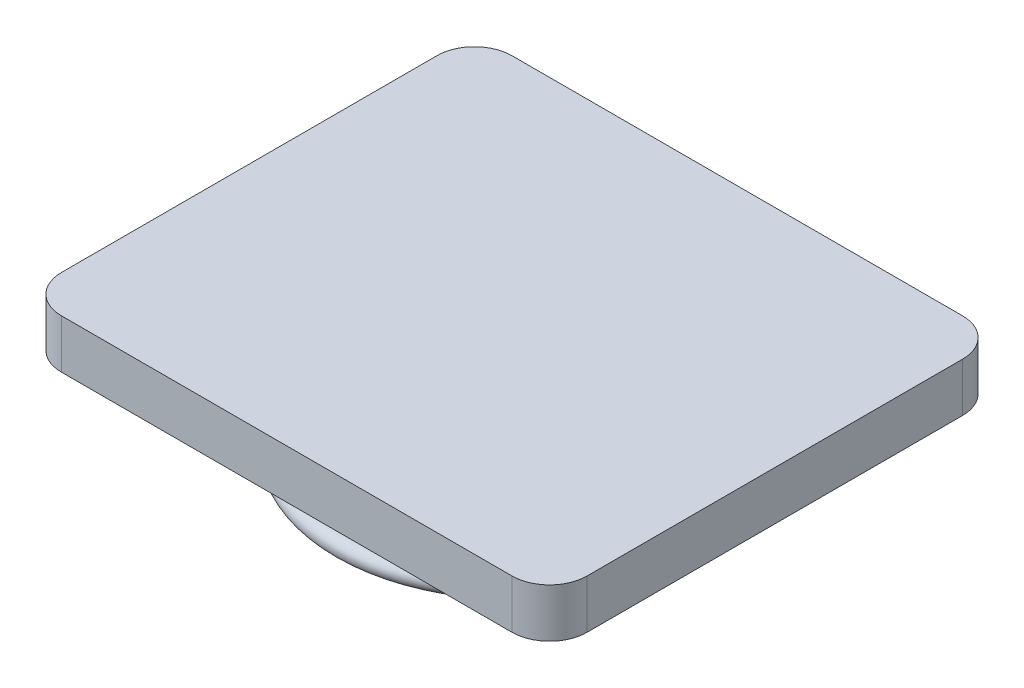
ISO-10303-21;
HEADER;
FILE_DESCRIPTION(('STEP AP214'),'2;1');
FILE_NAME('part.step','',(''),(''),'','','');
FILE_SCHEMA(('AUTOMOTIVE_DESIGN { 1 0 10303 214 1 1 1 1 }'));
ENDSEC;
DATA;
#1=APPLICATION_CONTEXT('core data for automotive mechanical design processes');
#2=APPLICATION_PROTOCOL_DEFINITION('international standard','automotive_design',2000,#1);
#3=PRODUCT_CONTEXT('',#1,'mechanical');
#4=PRODUCT('Part','Part','',(#3));
#5=PRODUCT_RELATED_PRODUCT_CATEGORY('part','',(#4));
#6=PRODUCT_DEFINITION_FORMATION('','',#4);
#7=PRODUCT_DEFINITION_CONTEXT('part definition',#1,'design');
#8=PRODUCT_DEFINITION('design','',#6,#7);
#9=PRODUCT_DEFINITION_SHAPE('','',#8);
#10=(LENGTH_UNIT() NAMED_UNIT(*) SI_UNIT(.MILLI.,.METRE.));
#11=(NAMED_UNIT(*) PLANE_ANGLE_UNIT() SI_UNIT($,.RADIAN.));
#12=(NAMED_UNIT(*) SI_UNIT($,.STERADIAN.) SOLID_ANGLE_UNIT());
#13=UNCERTAINTY_MEASURE_WITH_UNIT(LENGTH_MEASURE(1.E-05),#10,'distance_accuracy_value','');
#14=(GEOMETRIC_REPRESENTATION_CONTEXT(3) GLOBAL_UNCERTAINTY_ASSIGNED_CONTEXT((#13)) GLOBAL_UNIT_ASSIGNED_CONTEXT((#10,
#11,#12)) REPRESENTATION_CONTEXT('',''));
#15=CARTESIAN_POINT('',(0.,0.,0.));
#16=DIRECTION('',(0.,0.,1.));
#17=DIRECTION('',(1.,0.,0.));
#18=AXIS2_PLACEMENT_3D('',#15,#16,#17);
#19=CARTESIAN_POINT('',(0.,10.,0.));
#20=DIRECTION('',(0.,-1.,0.));
#21=DIRECTION('',(0.,0.,-1.));
#22=AXIS2_PLACEMENT_3D('',#19,#20,#21);
#23=CYLINDRICAL_SURFACE('',#22,22.5);
#24=CARTESIAN_POINT('',(0.,2.5,0.));
#25=DIRECTION('',(0.,-1.,0.));
#26=DIRECTION('',(0.,0.,-1.));
#27=AXIS2_PLACEMENT_3D('',#24,#25,#26);
#28=CIRCLE('',#27,22.5);
#29=CARTESIAN_POINT('',(0.,2.5,22.5));
#30=VERTEX_POINT('',#29);
#31=EDGE_CURVE('E181',#30,#30,#28,.F.);
#32=ORIENTED_EDGE('',*,*,#31,.T.);
#33=EDGE_LOOP('',(#32));
#34=FACE_BOUND('',#33,.T.);
#35=CARTESIAN_POINT('',(0.,10.,0.));
#36=DIRECTION('',(0.,1.,0.));
#37=DIRECTION('',(0.,0.,1.));
#38=AXIS2_PLACEMENT_3D('',#35,#36,#37);
#39=CIRCLE('',#38,22.5);
#40=CARTESIAN_POINT('',(0.,10.,22.5));
#41=VERTEX_POINT('',#40);
#42=EDGE_CURVE('E112',#41,#41,#39,.T.);
#43=ORIENTED_EDGE('',*,*,#42,.F.);
#44=EDGE_LOOP('',(#43));
#45=FACE_BOUND('',#44,.T.);
#46=ADVANCED_FACE('F38',(#34,#45),#23,.T.);
#47=CARTESIAN_POINT('',(35.,16.5,30.));
#48=DIRECTION('',(-1.,0.,0.));
#49=DIRECTION('',(0.,0.,1.));
#50=AXIS2_PLACEMENT_3D('',#47,#48,#49);
#51=PLANE('',#50);
#52=DIRECTION('',(0.,0.,-1.));
#53=VECTOR('',#52,1.);
#54=CARTESIAN_POINT('',(35.,16.5,30.));
#55=LINE('',#54,#53);
#56=CARTESIAN_POINT('',(35.,16.5,25.));
#57=VERTEX_POINT('',#56);
#58=CARTESIAN_POINT('',(35.,16.5,-25.));
#59=VERTEX_POINT('',#58);
#60=EDGE_CURVE('E176',#57,#59,#55,.T.);
#61=ORIENTED_EDGE('',*,*,#60,.F.);
#62=DIRECTION('',(0.,-1.,0.));
#63=VECTOR('',#62,1.);
#64=CARTESIAN_POINT('',(35.,16.5,25.));
#65=LINE('',#64,#63);
#66=CARTESIAN_POINT('',(35.,10.,25.));
#67=VERTEX_POINT('',#66);
#68=EDGE_CURVE('E133',#57,#67,#65,.T.);
#69=ORIENTED_EDGE('',*,*,#68,.T.);
#70=DIRECTION('',(0.,0.,-1.));
#71=VECTOR('',#70,1.);
#72=CARTESIAN_POINT('',(35.,10.,30.));
#73=LINE('',#72,#71);
#74=CARTESIAN_POINT('',(35.,10.,-25.));
#75=VERTEX_POINT('',#74);
#76=EDGE_CURVE('E177',#67,#75,#73,.T.);
#77=ORIENTED_EDGE('',*,*,#76,.T.);
#78=DIRECTION('',(0.,-1.,0.));
#79=VECTOR('',#78,1.);
#80=CARTESIAN_POINT('',(35.,16.5,-25.));
#81=LINE('',#80,#79);
#82=EDGE_CURVE('E131',#75,#59,#81,.F.);
#83=ORIENTED_EDGE('',*,*,#82,.T.);
#84=EDGE_LOOP('',(#61,#69,#77,#83));
#85=FACE_BOUND('',#84,.T.);
#86=ADVANCED_FACE('F196',(#85),#51,.F.);
#87=CARTESIAN_POINT('',(-35.,16.5,-30.));
#88=DIRECTION('',(0.,0.,1.));
#89=DIRECTION('',(1.,0.,0.));
#90=AXIS2_PLACEMENT_3D('',#87,#88,#89);
#91=PLANE('',#90);
#92=DIRECTION('',(-1.,0.,0.));
#93=VECTOR('',#92,1.);
#94=CARTESIAN_POINT('',(-35.,16.5,-30.));
#95=LINE('',#94,#93);
#96=CARTESIAN_POINT('',(30.,16.5,-30.));
#97=VERTEX_POINT('',#96);
#98=CARTESIAN_POINT('',(-30.,16.5,-30.));
#99=VERTEX_POINT('',#98);
#100=EDGE_CURVE('E184',#97,#99,#95,.T.);
#101=ORIENTED_EDGE('',*,*,#100,.F.);
#102=DIRECTION('',(0.,-1.,0.));
#103=VECTOR('',#102,1.);
#104=CARTESIAN_POINT('',(30.,16.5,-30.));
#105=LINE('',#104,#103);
#106=CARTESIAN_POINT('',(30.,10.,-30.));
#107=VERTEX_POINT('',#106);
#108=EDGE_CURVE('E158',#97,#107,#105,.T.);
#109=ORIENTED_EDGE('',*,*,#108,.T.);
#110=DIRECTION('',(-1.,0.,0.));
#111=VECTOR('',#110,1.);
#112=CARTESIAN_POINT('',(-35.,10.,-30.));
#113=LINE('',#112,#111);
#114=CARTESIAN_POINT('',(-30.,10.,-30.));
#115=VERTEX_POINT('',#114);
#116=EDGE_CURVE('E173',#107,#115,#113,.T.);
#117=ORIENTED_EDGE('',*,*,#116,.T.);
#118=DIRECTION('',(0.,-1.,0.));
#119=VECTOR('',#118,1.);
#120=CARTESIAN_POINT('',(-30.,16.5,-30.));
#121=LINE('',#120,#119);
#122=EDGE_CURVE('E156',#115,#99,#121,.F.);
#123=ORIENTED_EDGE('',*,*,#122,.T.);
#124=EDGE_LOOP('',(#101,#109,#117,#123));
#125=FACE_BOUND('',#124,.T.);
#126=ADVANCED_FACE('F216',(#125),#91,.F.);
#127=CARTESIAN_POINT('',(-35.,16.5,30.));
#128=DIRECTION('',(1.,0.,0.));
#129=DIRECTION('',(0.,0.,-1.));
#130=AXIS2_PLACEMENT_3D('',#127,#128,#129);
#131=PLANE('',#130);
#132=DIRECTION('',(0.,0.,1.));
#133=VECTOR('',#132,1.);
#134=CARTESIAN_POINT('',(-35.,10.,30.));
#135=LINE('',#134,#133);
#136=CARTESIAN_POINT('',(-35.,10.,-25.));
#137=VERTEX_POINT('',#136);
#138=CARTESIAN_POINT('',(-35.,10.,25.));
#139=VERTEX_POINT('',#138);
#140=EDGE_CURVE('E164',#137,#139,#135,.T.);
#141=ORIENTED_EDGE('',*,*,#140,.T.);
#142=DIRECTION('',(0.,-1.,0.));
#143=VECTOR('',#142,1.);
#144=CARTESIAN_POINT('',(-35.,16.5,25.));
#145=LINE('',#144,#143);
#146=CARTESIAN_POINT('',(-35.,16.5,25.));
#147=VERTEX_POINT('',#146);
#148=EDGE_CURVE('E11',#139,#147,#145,.F.);
#149=ORIENTED_EDGE('',*,*,#148,.T.);
#150=DIRECTION('',(0.,0.,1.));
#151=VECTOR('',#150,1.);
#152=CARTESIAN_POINT('',(-35.,16.5,30.));
#153=LINE('',#152,#151);
#154=CARTESIAN_POINT('',(-35.,16.5,-25.));
#155=VERTEX_POINT('',#154);
#156=EDGE_CURVE('E119',#155,#147,#153,.T.);
#157=ORIENTED_EDGE('',*,*,#156,.F.);
#158=DIRECTION('',(0.,-1.,0.));
#159=VECTOR('',#158,1.);
#160=CARTESIAN_POINT('',(-35.,16.5,-25.));
#161=LINE('',#160,#159);
#162=EDGE_CURVE('E46',#155,#137,#161,.T.);
#163=ORIENTED_EDGE('',*,*,#162,.T.);
#164=EDGE_LOOP('',(#141,#149,#157,#163));
#165=FACE_BOUND('',#164,.T.);
#166=ADVANCED_FACE('F163',(#165),#131,.F.);
#167=CARTESIAN_POINT('',(-35.,16.5,30.));
#168=DIRECTION('',(0.,0.,-1.));
#169=DIRECTION('',(-1.,0.,0.));
#170=AXIS2_PLACEMENT_3D('',#167,#168,#169);
#171=PLANE('',#170);
#172=DIRECTION('',(1.,0.,0.));
#173=VECTOR('',#172,1.);
#174=CARTESIAN_POINT('',(-35.,10.,30.));
#175=LINE('',#174,#173);
#176=CARTESIAN_POINT('',(-30.,10.,30.));
#177=VERTEX_POINT('',#176);
#178=CARTESIAN_POINT('',(30.,10.,30.));
#179=VERTEX_POINT('',#178);
#180=EDGE_CURVE('E172',#177,#179,#175,.T.);
#181=ORIENTED_EDGE('',*,*,#180,.T.);
#182=DIRECTION('',(0.,-1.,0.));
#183=VECTOR('',#182,1.);
#184=CARTESIAN_POINT('',(30.,16.5,30.));
#185=LINE('',#184,#183);
#186=CARTESIAN_POINT('',(30.,16.5,30.));
#187=VERTEX_POINT('',#186);
#188=EDGE_CURVE('E147',#179,#187,#185,.F.);
#189=ORIENTED_EDGE('',*,*,#188,.T.);
#190=DIRECTION('',(1.,0.,0.));
#191=VECTOR('',#190,1.);
#192=CARTESIAN_POINT('',(-35.,16.5,30.));
#193=LINE('',#192,#191);
#194=CARTESIAN_POINT('',(-30.,16.5,30.));
#195=VERTEX_POINT('',#194);
#196=EDGE_CURVE('E113',#195,#187,#193,.T.);
#197=ORIENTED_EDGE('',*,*,#196,.F.);
#198=DIRECTION('',(0.,-1.,0.));
#199=VECTOR('',#198,1.);
#200=CARTESIAN_POINT('',(-30.,16.5,30.));
#201=LINE('',#200,#199);
#202=EDGE_CURVE('E144',#195,#177,#201,.T.);
#203=ORIENTED_EDGE('',*,*,#202,.T.);
#204=EDGE_LOOP('',(#181,#189,#197,#203));
#205=FACE_BOUND('',#204,.T.);
#206=ADVANCED_FACE('F208',(#205),#171,.F.);
#207=CARTESIAN_POINT('',(0.,16.5,0.));
#208=DIRECTION('',(0.,-1.,0.));
#209=DIRECTION('',(0.,0.,-1.));
#210=AXIS2_PLACEMENT_3D('',#207,#208,#209);
#211=PLANE('',#210);
#212=ORIENTED_EDGE('',*,*,#196,.T.);
#213=CARTESIAN_POINT('',(30.,16.5,25.));
#214=DIRECTION('',(0.,-1.,0.));
#215=DIRECTION('',(0.,0.,-1.));
#216=AXIS2_PLACEMENT_3D('',#213,#214,#215);
#217=CIRCLE('',#216,5.);
#218=EDGE_CURVE('E154',#187,#57,#217,.F.);
#219=ORIENTED_EDGE('',*,*,#218,.T.);
#220=ORIENTED_EDGE('',*,*,#60,.T.);
#221=CARTESIAN_POINT('',(30.,16.5,-25.));
#222=DIRECTION('',(0.,-1.,0.));
#223=DIRECTION('',(0.,0.,-1.));
#224=AXIS2_PLACEMENT_3D('',#221,#222,#223);
#225=CIRCLE('',#224,5.);
#226=EDGE_CURVE('E152',#59,#97,#225,.F.);
#227=ORIENTED_EDGE('',*,*,#226,.T.);
#228=ORIENTED_EDGE('',*,*,#100,.T.);
#229=CARTESIAN_POINT('',(-30.,16.5,-25.));
#230=DIRECTION('',(0.,-1.,0.));
#231=DIRECTION('',(0.,0.,-1.));
#232=AXIS2_PLACEMENT_3D('',#229,#230,#231);
#233=CIRCLE('',#232,5.);
#234=EDGE_CURVE('E58',#99,#155,#233,.F.);
#235=ORIENTED_EDGE('',*,*,#234,.T.);
#236=ORIENTED_EDGE('',*,*,#156,.T.);
#237=CARTESIAN_POINT('',(-30.,16.5,25.));
#238=DIRECTION('',(0.,-1.,0.));
#239=DIRECTION('',(0.,0.,-1.));
#240=AXIS2_PLACEMENT_3D('',#237,#238,#239);
#241=CIRCLE('',#240,5.);
#242=EDGE_CURVE('E150',#147,#195,#241,.F.);
#243=ORIENTED_EDGE('',*,*,#242,.T.);
#244=EDGE_LOOP('',(#212,#219,#220,#227,#228,#235,#236,#243));
#245=FACE_BOUND('',#244,.T.);
#246=ADVANCED_FACE('F201',(#245),#211,.F.);
#247=CARTESIAN_POINT('',(0.,10.,0.));
#248=DIRECTION('',(0.,-1.,0.));
#249=DIRECTION('',(0.,0.,-1.));
#250=AXIS2_PLACEMENT_3D('',#247,#248,#249);
#251=PLANE('',#250);
#252=ORIENTED_EDGE('',*,*,#42,.T.);
#253=EDGE_LOOP('',(#252));
#254=FACE_BOUND('',#253,.T.);
#255=ORIENTED_EDGE('',*,*,#76,.F.);
#256=CARTESIAN_POINT('',(30.,10.,25.));
#257=DIRECTION('',(0.,-1.,0.));
#258=DIRECTION('',(0.,0.,-1.));
#259=AXIS2_PLACEMENT_3D('',#256,#257,#258);
#260=CIRCLE('',#259,5.);
#261=EDGE_CURVE('E142',#67,#179,#260,.T.);
#262=ORIENTED_EDGE('',*,*,#261,.T.);
#263=ORIENTED_EDGE('',*,*,#180,.F.);
#264=CARTESIAN_POINT('',(-30.,10.,25.));
#265=DIRECTION('',(0.,-1.,0.));
#266=DIRECTION('',(0.,0.,-1.));
#267=AXIS2_PLACEMENT_3D('',#264,#265,#266);
#268=CIRCLE('',#267,5.);
#269=EDGE_CURVE('E138',#177,#139,#268,.T.);
#270=ORIENTED_EDGE('',*,*,#269,.T.);
#271=ORIENTED_EDGE('',*,*,#140,.F.);
#272=CARTESIAN_POINT('',(-30.,10.,-25.));
#273=DIRECTION('',(0.,-1.,0.));
#274=DIRECTION('',(0.,0.,-1.));
#275=AXIS2_PLACEMENT_3D('',#272,#273,#274);
#276=CIRCLE('',#275,5.);
#277=EDGE_CURVE('E136',#137,#115,#276,.T.);
#278=ORIENTED_EDGE('',*,*,#277,.T.);
#279=ORIENTED_EDGE('',*,*,#116,.F.);
#280=CARTESIAN_POINT('',(30.,10.,-25.));
#281=DIRECTION('',(0.,-1.,0.));
#282=DIRECTION('',(0.,0.,-1.));
#283=AXIS2_PLACEMENT_3D('',#280,#281,#282);
#284=CIRCLE('',#283,5.);
#285=EDGE_CURVE('E140',#107,#75,#284,.T.);
#286=ORIENTED_EDGE('',*,*,#285,.T.);
#287=EDGE_LOOP('',(#255,#262,#263,#270,#271,#278,#279,#286));
#288=FACE_BOUND('',#287,.T.);
#289=ADVANCED_FACE('F168',(#254,#288),#251,.T.);
#290=CARTESIAN_POINT('',(0.,1.25,0.));
#291=DIRECTION('',(0.,1.,0.));
#292=DIRECTION('',(0.,0.,1.));
#293=AXIS2_PLACEMENT_3D('',#290,#291,#292);
#294=TOROIDAL_SURFACE('',#293,22.5,1.25);
#295=ORIENTED_EDGE('',*,*,#31,.F.);
#296=CARTESIAN_POINT('',(0.,1.25,22.5));
#297=DIRECTION('',(1.,0.,0.));
#298=DIRECTION('',(0.,0.,-1.));
#299=AXIS2_PLACEMENT_3D('',#296,#297,#298);
#300=CIRCLE('',#299,1.25);
#301=CARTESIAN_POINT('',(0.,0.,22.5));
#302=VERTEX_POINT('',#301);
#303=EDGE_CURVE('E190',#30,#302,#300,.T.);
#304=ORIENTED_EDGE('',*,*,#303,.T.);
#305=CARTESIAN_POINT('',(0.,0.,0.));
#306=DIRECTION('',(0.,1.,0.));
#307=DIRECTION('',(0.,0.,1.));
#308=AXIS2_PLACEMENT_3D('',#305,#306,#307);
#309=CIRCLE('',#308,22.5);
#310=EDGE_CURVE('E108',#302,#302,#309,.T.);
#311=ORIENTED_EDGE('',*,*,#310,.T.);
#312=ORIENTED_EDGE('',*,*,#303,.F.);
#313=EDGE_LOOP('',(#295,#304,#311,#312));
#314=FACE_BOUND('',#313,.T.);
#315=ADVANCED_FACE('F192',(#314),#294,.T.);
#316=CARTESIAN_POINT('',(0.,0.,0.));
#317=DIRECTION('',(0.,1.,0.));
#318=DIRECTION('',(0.,0.,1.));
#319=AXIS2_PLACEMENT_3D('',#316,#317,#318);
#320=PLANE('',#319);
#321=CARTESIAN_POINT('',(0.,0.,0.));
#322=DIRECTION('',(0.,1.,0.));
#323=DIRECTION('',(0.,0.,1.));
#324=AXIS2_PLACEMENT_3D('',#321,#322,#323);
#325=CIRCLE('',#324,5.);
#326=CARTESIAN_POINT('',(0.,0.,5.));
#327=VERTEX_POINT('',#326);
#328=EDGE_CURVE('E116',#327,#327,#325,.F.);
#329=ORIENTED_EDGE('',*,*,#328,.F.);
#330=EDGE_LOOP('',(#329));
#331=FACE_BOUND('',#330,.T.);
#332=ORIENTED_EDGE('',*,*,#310,.F.);
#333=EDGE_LOOP('',(#332));
#334=FACE_BOUND('',#333,.T.);
#335=ADVANCED_FACE('F109',(#331,#334),#320,.F.);
#336=CARTESIAN_POINT('',(0.,-13.,0.));
#337=DIRECTION('',(0.,1.,0.));
#338=DIRECTION('',(0.,0.,1.));
#339=AXIS2_PLACEMENT_3D('',#336,#337,#338);
#340=CYLINDRICAL_SURFACE('',#339,5.);
#341=CARTESIAN_POINT('',(0.,-12.5000000000001,0.));
#342=DIRECTION('',(0.,-1.,0.));
#343=DIRECTION('',(0.,0.,-1.));
#344=AXIS2_PLACEMENT_3D('',#341,#342,#343);
#345=CIRCLE('',#344,5.);
#346=CARTESIAN_POINT('',(0.,-12.5000000000001,5.));
#347=VERTEX_POINT('',#346);
#348=EDGE_CURVE('E128',#347,#347,#345,.F.);
#349=CARTESIAN_POINT('',(0.,-12.5000000000001,5.));
#350=CARTESIAN_POINT('',(0.,-12.3697916666667,5.));
#351=CARTESIAN_POINT('',(0.,-12.2395833333334,5.));
#352=CARTESIAN_POINT('',(0.,-11.9791666666667,5.));
#353=CARTESIAN_POINT('',(0.,-11.8489583333334,5.));
#354=CARTESIAN_POINT('',(0.,-11.5885416666667,5.));
#355=CARTESIAN_POINT('',(0.,-11.4583333333334,5.));
#356=CARTESIAN_POINT('',(0.,-11.1979166666667,5.));
#357=CARTESIAN_POINT('',(0.,-11.0677083333334,5.));
#358=CARTESIAN_POINT('',(0.,-10.8072916666667,5.));
#359=CARTESIAN_POINT('',(0.,-10.6770833333334,5.));
#360=CARTESIAN_POINT('',(0.,-10.4166666666667,5.));
#361=CARTESIAN_POINT('',(0.,-10.2864583333334,5.));
#362=CARTESIAN_POINT('',(0.,-10.0260416666667,5.));
#363=CARTESIAN_POINT('',(0.,-9.89583333333339,5.));
#364=CARTESIAN_POINT('',(0.,-9.63541666666672,5.));
#365=CARTESIAN_POINT('',(0.,-9.50520833333339,5.));
#366=CARTESIAN_POINT('',(0.,-9.24479166666672,5.));
#367=CARTESIAN_POINT('',(0.,-9.11458333333338,5.));
#368=CARTESIAN_POINT('',(0.,-8.85416666666671,5.));
#369=CARTESIAN_POINT('',(0.,-8.72395833333338,5.));
#370=CARTESIAN_POINT('',(0.,-8.46354166666671,5.));
#371=CARTESIAN_POINT('',(0.,-8.33333333333338,5.));
#372=CARTESIAN_POINT('',(0.,-8.07291666666671,5.));
#373=CARTESIAN_POINT('',(0.,-7.94270833333338,5.));
#374=CARTESIAN_POINT('',(0.,-7.68229166666671,5.));
#375=CARTESIAN_POINT('',(0.,-7.55208333333337,5.));
#376=CARTESIAN_POINT('',(0.,-7.29166666666671,5.));
#377=CARTESIAN_POINT('',(0.,-7.16145833333337,5.));
#378=CARTESIAN_POINT('',(0.,-6.9010416666667,5.));
#379=CARTESIAN_POINT('',(0.,-6.77083333333337,5.));
#380=CARTESIAN_POINT('',(0.,-6.5104166666667,5.));
#381=CARTESIAN_POINT('',(0.,-6.38020833333337,5.));
#382=CARTESIAN_POINT('',(0.,-6.1197916666667,5.));
#383=CARTESIAN_POINT('',(0.,-5.98958333333337,5.));
#384=CARTESIAN_POINT('',(0.,-5.7291666666667,5.));
#385=CARTESIAN_POINT('',(0.,-5.59895833333336,5.));
#386=CARTESIAN_POINT('',(0.,-5.3385416666667,5.));
#387=CARTESIAN_POINT('',(0.,-5.20833333333336,5.));
#388=CARTESIAN_POINT('',(0.,-4.94791666666669,5.));
#389=CARTESIAN_POINT('',(0.,-4.81770833333336,5.));
#390=CARTESIAN_POINT('',(0.,-4.55729166666669,5.));
#391=CARTESIAN_POINT('',(0.,-4.42708333333336,5.));
#392=CARTESIAN_POINT('',(0.,-4.16666666666669,5.));
#393=CARTESIAN_POINT('',(0.,-4.03645833333335,5.));
#394=CARTESIAN_POINT('',(0.,-3.77604166666669,5.));
#395=CARTESIAN_POINT('',(0.,-3.64583333333335,5.));
#396=CARTESIAN_POINT('',(0.,-3.38541666666668,5.));
#397=CARTESIAN_POINT('',(0.,-3.25520833333335,5.));
#398=CARTESIAN_POINT('',(0.,-2.99479166666668,5.));
#399=CARTESIAN_POINT('',(0.,-2.86458333333335,5.));
#400=CARTESIAN_POINT('',(0.,-2.60416666666668,5.));
#401=CARTESIAN_POINT('',(0.,-2.47395833333335,5.));
#402=CARTESIAN_POINT('',(0.,-2.21354166666668,5.));
#403=CARTESIAN_POINT('',(0.,-2.08333333333334,5.));
#404=CARTESIAN_POINT('',(0.,-1.82291666666668,5.));
#405=CARTESIAN_POINT('',(0.,-1.69270833333334,5.));
#406=CARTESIAN_POINT('',(0.,-1.43229166666667,5.));
#407=CARTESIAN_POINT('',(0.,-1.30208333333334,5.));
#408=CARTESIAN_POINT('',(0.,-1.04166666666667,5.));
#409=CARTESIAN_POINT('',(0.,-0.911458333333338,5.));
#410=CARTESIAN_POINT('',(0.,-0.65104166666667,5.));
#411=CARTESIAN_POINT('',(0.,-0.520833333333336,5.));
#412=CARTESIAN_POINT('',(0.,-0.260416666666668,5.));
#413=CARTESIAN_POINT('',(0.,-0.130208333333334,5.));
#414=CARTESIAN_POINT('',(0.,0.,5.));
#415=B_SPLINE_CURVE_WITH_KNOTS('',3,(#349,#350,#351,#352,#353,#354,#355,#356,#357,#358,#359,
#360,#361,#362,#363,#364,#365,#366,#367,#368,#369,#370,#371,#372,#373,#374,#375,#376,#377,#378,
#379,#380,#381,#382,#383,#384,#385,#386,#387,#388,#389,#390,#391,#392,#393,#394,#395,#396,#397,
#398,#399,#400,#401,#402,#403,#404,#405,#406,#407,#408,#409,#410,#411,#412,#413,#414),
.UNSPECIFIED.,.F.,.F.,(4,2,2,2,2,2,2,2,2,2,2,2,2,2,2,2,2,2,2,2,2,2,2,2,2,2,2,2,2,2,2,2,4),(0.,
0.390625000000004,0.781250000000006,1.17187500000001,1.56250000000001,1.95312500000001,
2.34375000000001,2.73437500000002,3.12500000000002,3.51562500000002,3.90625000000002,
4.29687500000002,4.68750000000003,5.07812500000003,5.46875000000003,5.85937500000003,
6.25000000000003,6.64062500000004,7.03125000000004,7.42187500000004,7.81250000000004,
8.20312500000005,8.59375000000005,8.98437500000005,9.37500000000005,9.76562500000005,
10.1562500000001,10.5468750000001,10.9375000000001,11.3281250000001,11.7187500000001,
12.1093750000001,12.5000000000001),.UNSPECIFIED.);
#416=EDGE_CURVE('BSEAM224',#347,#327,#415,.T.);
#417=ORIENTED_EDGE('',*,*,#348,.T.);
#418=ORIENTED_EDGE('',*,*,#328,.T.);
#419=ORIENTED_EDGE('',*,*,#416,.T.);
#420=ORIENTED_EDGE('',*,*,#416,.F.);
#421=EDGE_LOOP('',(#417,#419,#418,#420));
#422=FACE_BOUND('',#421,.T.);
#423=ADVANCED_FACE('F224',(#422),#340,.T.);
#424=CARTESIAN_POINT('',(0.,-13.,0.));
#425=DIRECTION('',(0.,-1.,0.));
#426=DIRECTION('',(0.,0.,-1.));
#427=AXIS2_PLACEMENT_3D('',#424,#425,#426);
#428=PLANE('',#427);
#429=CARTESIAN_POINT('',(0.,-13.,0.));
#430=DIRECTION('',(0.,-1.,0.));
#431=DIRECTION('',(0.,0.,-1.));
#432=AXIS2_PLACEMENT_3D('',#429,#430,#431);
#433=CIRCLE('',#432,4.50000000000007);
#434=CARTESIAN_POINT('',(0.,-13.,-4.50000000000007));
#435=VERTEX_POINT('',#434);
#436=EDGE_CURVE('E125',#435,#435,#433,.T.);
#437=ORIENTED_EDGE('',*,*,#436,.T.);
#438=EDGE_LOOP('',(#437));
#439=FACE_BOUND('',#438,.T.);
#440=ADVANCED_FACE('F231',(#439),#428,.T.);
#441=CARTESIAN_POINT('',(0.,-13.,0.));
#442=DIRECTION('',(0.,1.,0.));
#443=DIRECTION('',(0.,0.,1.));
#444=AXIS2_PLACEMENT_3D('',#441,#442,#443);
#445=CONICAL_SURFACE('',#444,4.50000000000007,0.785398163397445);
#446=ORIENTED_EDGE('',*,*,#348,.F.);
#447=EDGE_LOOP('',(#446));
#448=FACE_BOUND('',#447,.T.);
#449=ORIENTED_EDGE('',*,*,#436,.F.);
#450=EDGE_LOOP('',(#449));
#451=FACE_BOUND('',#450,.T.);
#452=ADVANCED_FACE('F227',(#448,#451),#445,.T.);
#453=CARTESIAN_POINT('',(30.,16.5,25.));
#454=DIRECTION('',(0.,-1.,0.));
#455=DIRECTION('',(0.,0.,-1.));
#456=AXIS2_PLACEMENT_3D('',#453,#454,#455);
#457=CYLINDRICAL_SURFACE('',#456,5.);
#458=ORIENTED_EDGE('',*,*,#218,.F.);
#459=ORIENTED_EDGE('',*,*,#188,.F.);
#460=ORIENTED_EDGE('',*,*,#261,.F.);
#461=ORIENTED_EDGE('',*,*,#68,.F.);
#462=EDGE_LOOP('',(#458,#459,#460,#461));
#463=FACE_BOUND('',#462,.T.);
#464=ADVANCED_FACE('F230',(#463),#457,.T.);
#465=CARTESIAN_POINT('',(30.,16.5,-25.));
#466=DIRECTION('',(0.,-1.,0.));
#467=DIRECTION('',(0.,0.,-1.));
#468=AXIS2_PLACEMENT_3D('',#465,#466,#467);
#469=CYLINDRICAL_SURFACE('',#468,5.);
#470=ORIENTED_EDGE('',*,*,#226,.F.);
#471=ORIENTED_EDGE('',*,*,#82,.F.);
#472=ORIENTED_EDGE('',*,*,#285,.F.);
#473=ORIENTED_EDGE('',*,*,#108,.F.);
#474=EDGE_LOOP('',(#470,#471,#472,#473));
#475=FACE_BOUND('',#474,.T.);
#476=ADVANCED_FACE('F235',(#475),#469,.T.);
#477=CARTESIAN_POINT('',(-30.,16.5,25.));
#478=DIRECTION('',(0.,-1.,0.));
#479=DIRECTION('',(0.,0.,-1.));
#480=AXIS2_PLACEMENT_3D('',#477,#478,#479);
#481=CYLINDRICAL_SURFACE('',#480,5.);
#482=ORIENTED_EDGE('',*,*,#242,.F.);
#483=ORIENTED_EDGE('',*,*,#148,.F.);
#484=ORIENTED_EDGE('',*,*,#269,.F.);
#485=ORIENTED_EDGE('',*,*,#202,.F.);
#486=EDGE_LOOP('',(#482,#483,#484,#485));
#487=FACE_BOUND('',#486,.T.);
#488=ADVANCED_FACE('F238',(#487),#481,.T.);
#489=CARTESIAN_POINT('',(-30.,16.5,-25.));
#490=DIRECTION('',(0.,-1.,0.));
#491=DIRECTION('',(0.,0.,-1.));
#492=AXIS2_PLACEMENT_3D('',#489,#490,#491);
#493=CYLINDRICAL_SURFACE('',#492,5.);
#494=ORIENTED_EDGE('',*,*,#234,.F.);
#495=ORIENTED_EDGE('',*,*,#122,.F.);
#496=ORIENTED_EDGE('',*,*,#277,.F.);
#497=ORIENTED_EDGE('',*,*,#162,.F.);
#498=EDGE_LOOP('',(#494,#495,#496,#497));
#499=FACE_BOUND('',#498,.T.);
#500=ADVANCED_FACE('F40',(#499),#493,.T.);
#501=CLOSED_SHELL('',(#46,#86,#126,#166,#206,#246,#289,#315,#335,#423,#440,#452,#464,#476,#488,#500));
#502=MANIFOLD_SOLID_BREP('B2',#501);
#503=ADVANCED_BREP_SHAPE_REPRESENTATION('',(#18,#502),#14);
#504=SHAPE_DEFINITION_REPRESENTATION(#9,#503);
ENDSEC;
END-ISO-10303-21;
